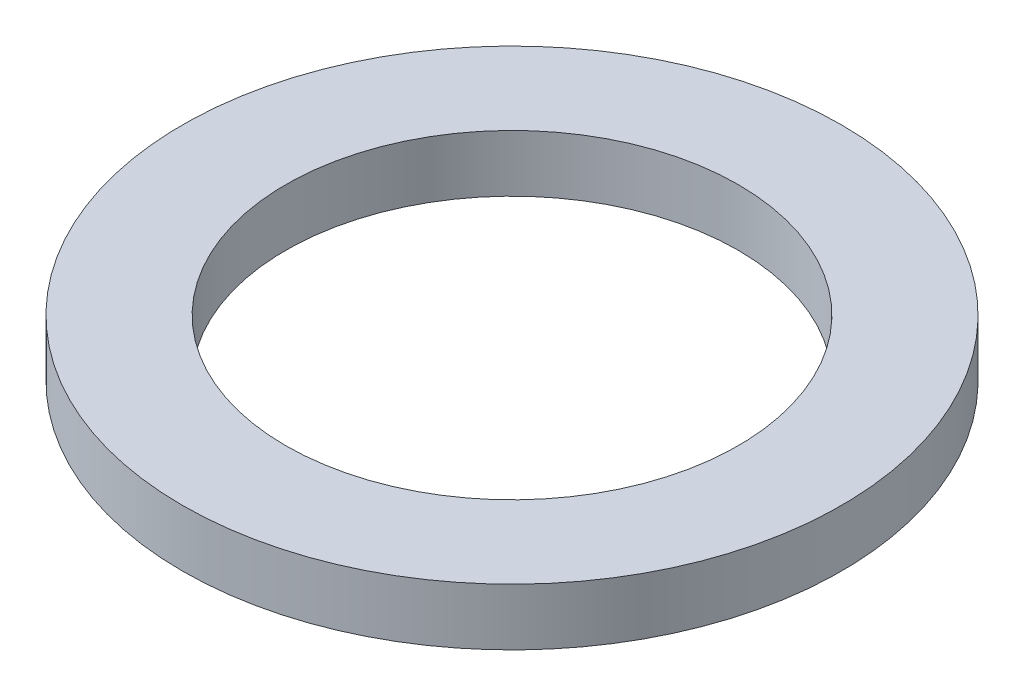
ISO-10303-21;
HEADER;
FILE_DESCRIPTION(('STEP AP214'),'2;1');
FILE_NAME('part.step','',(''),(''),'','','');
FILE_SCHEMA(('AUTOMOTIVE_DESIGN { 1 0 10303 214 1 1 1 1 }'));
ENDSEC;
DATA;
#1=APPLICATION_CONTEXT('core data for automotive mechanical design processes');
#2=APPLICATION_PROTOCOL_DEFINITION('international standard','automotive_design',2000,#1);
#3=PRODUCT_CONTEXT('',#1,'mechanical');
#4=PRODUCT('Part','Part','',(#3));
#5=PRODUCT_RELATED_PRODUCT_CATEGORY('part','',(#4));
#6=PRODUCT_DEFINITION_FORMATION('','',#4);
#7=PRODUCT_DEFINITION_CONTEXT('part definition',#1,'design');
#8=PRODUCT_DEFINITION('design','',#6,#7);
#9=PRODUCT_DEFINITION_SHAPE('','',#8);
#10=(LENGTH_UNIT() NAMED_UNIT(*) SI_UNIT(.MILLI.,.METRE.));
#11=(NAMED_UNIT(*) PLANE_ANGLE_UNIT() SI_UNIT($,.RADIAN.));
#12=(NAMED_UNIT(*) SI_UNIT($,.STERADIAN.) SOLID_ANGLE_UNIT());
#13=UNCERTAINTY_MEASURE_WITH_UNIT(LENGTH_MEASURE(1.E-05),#10,'distance_accuracy_value','');
#14=(GEOMETRIC_REPRESENTATION_CONTEXT(3) GLOBAL_UNCERTAINTY_ASSIGNED_CONTEXT((#13)) GLOBAL_UNIT_ASSIGNED_CONTEXT((#10,
#11,#12)) REPRESENTATION_CONTEXT('',''));
#15=CARTESIAN_POINT('',(0.,0.,0.));
#16=DIRECTION('',(0.,0.,1.));
#17=DIRECTION('',(1.,0.,0.));
#18=AXIS2_PLACEMENT_3D('',#15,#16,#17);
#19=CARTESIAN_POINT('',(0.,0.4826,0.));
#20=DIRECTION('',(0.,1.,0.));
#21=DIRECTION('',(0.,0.,1.));
#22=AXIS2_PLACEMENT_3D('',#19,#20,#21);
#23=PLANE('',#22);
#24=CARTESIAN_POINT('',(0.,0.4826,0.));
#25=DIRECTION('',(0.,1.,0.));
#26=DIRECTION('',(0.,0.,1.));
#27=AXIS2_PLACEMENT_3D('',#24,#25,#26);
#28=CIRCLE('',#27,2.794);
#29=CARTESIAN_POINT('',(0.,0.4826,-2.794));
#30=VERTEX_POINT('',#29);
#31=EDGE_CURVE('E10',#30,#30,#28,.T.);
#32=ORIENTED_EDGE('',*,*,#31,.T.);
#33=EDGE_LOOP('',(#32));
#34=FACE_BOUND('',#33,.T.);
#35=CARTESIAN_POINT('',(0.,0.4826,0.));
#36=DIRECTION('',(0.,1.,0.));
#37=DIRECTION('',(0.,0.,1.));
#38=AXIS2_PLACEMENT_3D('',#35,#36,#37);
#39=CIRCLE('',#38,1.9177);
#40=CARTESIAN_POINT('',(0.,0.4826,-1.9177));
#41=VERTEX_POINT('',#40);
#42=EDGE_CURVE('E41',#41,#41,#39,.T.);
#43=ORIENTED_EDGE('',*,*,#42,.F.);
#44=EDGE_LOOP('',(#43));
#45=FACE_BOUND('',#44,.T.);
#46=ADVANCED_FACE('F30',(#34,#45),#23,.T.);
#47=CARTESIAN_POINT('',(0.,0.,0.));
#48=DIRECTION('',(0.,1.,0.));
#49=DIRECTION('',(0.,0.,1.));
#50=AXIS2_PLACEMENT_3D('',#47,#48,#49);
#51=PLANE('',#50);
#52=CARTESIAN_POINT('',(0.,0.,0.));
#53=DIRECTION('',(0.,1.,0.));
#54=DIRECTION('',(0.,0.,1.));
#55=AXIS2_PLACEMENT_3D('',#52,#53,#54);
#56=CIRCLE('',#55,2.794);
#57=CARTESIAN_POINT('',(0.,0.,-2.794));
#58=VERTEX_POINT('',#57);
#59=EDGE_CURVE('E34',#58,#58,#56,.T.);
#60=ORIENTED_EDGE('',*,*,#59,.F.);
#61=EDGE_LOOP('',(#60));
#62=FACE_BOUND('',#61,.T.);
#63=CARTESIAN_POINT('',(0.,0.,0.));
#64=DIRECTION('',(0.,1.,0.));
#65=DIRECTION('',(0.,0.,1.));
#66=AXIS2_PLACEMENT_3D('',#63,#64,#65);
#67=CIRCLE('',#66,1.9177);
#68=CARTESIAN_POINT('',(0.,0.,-1.9177));
#69=VERTEX_POINT('',#68);
#70=EDGE_CURVE('E43',#69,#69,#67,.T.);
#71=ORIENTED_EDGE('',*,*,#70,.T.);
#72=EDGE_LOOP('',(#71));
#73=FACE_BOUND('',#72,.T.);
#74=ADVANCED_FACE('F53',(#62,#73),#51,.F.);
#75=CARTESIAN_POINT('',(0.,0.4826,0.));
#76=DIRECTION('',(0.,-1.,0.));
#77=DIRECTION('',(0.,0.,-1.));
#78=AXIS2_PLACEMENT_3D('',#75,#76,#77);
#79=CYLINDRICAL_SURFACE('',#78,2.794);
#80=CARTESIAN_POINT('',(0.,0.4826,-2.794));
#81=CARTESIAN_POINT('',(0.,0.477572916666667,-2.794));
#82=CARTESIAN_POINT('',(0.,0.472545833333333,-2.794));
#83=CARTESIAN_POINT('',(0.,0.462491666666667,-2.794));
#84=CARTESIAN_POINT('',(0.,0.457464583333333,-2.794));
#85=CARTESIAN_POINT('',(0.,0.447410416666667,-2.794));
#86=CARTESIAN_POINT('',(0.,0.442383333333333,-2.794));
#87=CARTESIAN_POINT('',(0.,0.432329166666667,-2.794));
#88=CARTESIAN_POINT('',(0.,0.427302083333333,-2.794));
#89=CARTESIAN_POINT('',(0.,0.417247916666667,-2.794));
#90=CARTESIAN_POINT('',(0.,0.412220833333333,-2.794));
#91=CARTESIAN_POINT('',(0.,0.402166666666667,-2.794));
#92=CARTESIAN_POINT('',(0.,0.397139583333333,-2.794));
#93=CARTESIAN_POINT('',(0.,0.387085416666667,-2.794));
#94=CARTESIAN_POINT('',(0.,0.382058333333333,-2.794));
#95=CARTESIAN_POINT('',(0.,0.372004166666667,-2.794));
#96=CARTESIAN_POINT('',(0.,0.366977083333333,-2.794));
#97=CARTESIAN_POINT('',(0.,0.356922916666667,-2.794));
#98=CARTESIAN_POINT('',(0.,0.351895833333333,-2.794));
#99=CARTESIAN_POINT('',(0.,0.341841666666667,-2.794));
#100=CARTESIAN_POINT('',(0.,0.336814583333333,-2.794));
#101=CARTESIAN_POINT('',(0.,0.326760416666667,-2.794));
#102=CARTESIAN_POINT('',(0.,0.321733333333333,-2.794));
#103=CARTESIAN_POINT('',(0.,0.311679166666667,-2.794));
#104=CARTESIAN_POINT('',(0.,0.306652083333333,-2.794));
#105=CARTESIAN_POINT('',(0.,0.296597916666667,-2.794));
#106=CARTESIAN_POINT('',(0.,0.291570833333333,-2.794));
#107=CARTESIAN_POINT('',(0.,0.281516666666667,-2.794));
#108=CARTESIAN_POINT('',(0.,0.276489583333333,-2.794));
#109=CARTESIAN_POINT('',(0.,0.266435416666667,-2.794));
#110=CARTESIAN_POINT('',(0.,0.261408333333333,-2.794));
#111=CARTESIAN_POINT('',(0.,0.251354166666667,-2.794));
#112=CARTESIAN_POINT('',(0.,0.246327083333333,-2.794));
#113=CARTESIAN_POINT('',(0.,0.236272916666667,-2.794));
#114=CARTESIAN_POINT('',(0.,0.231245833333333,-2.794));
#115=CARTESIAN_POINT('',(0.,0.221191666666667,-2.794));
#116=CARTESIAN_POINT('',(0.,0.216164583333333,-2.794));
#117=CARTESIAN_POINT('',(0.,0.206110416666667,-2.794));
#118=CARTESIAN_POINT('',(0.,0.201083333333333,-2.794));
#119=CARTESIAN_POINT('',(0.,0.191029166666667,-2.794));
#120=CARTESIAN_POINT('',(0.,0.186002083333333,-2.794));
#121=CARTESIAN_POINT('',(0.,0.175947916666667,-2.794));
#122=CARTESIAN_POINT('',(0.,0.170920833333333,-2.794));
#123=CARTESIAN_POINT('',(0.,0.160866666666667,-2.794));
#124=CARTESIAN_POINT('',(0.,0.155839583333333,-2.794));
#125=CARTESIAN_POINT('',(0.,0.145785416666667,-2.794));
#126=CARTESIAN_POINT('',(0.,0.140758333333333,-2.794));
#127=CARTESIAN_POINT('',(0.,0.130704166666667,-2.794));
#128=CARTESIAN_POINT('',(0.,0.125677083333333,-2.794));
#129=CARTESIAN_POINT('',(0.,0.115622916666667,-2.794));
#130=CARTESIAN_POINT('',(0.,0.110595833333333,-2.794));
#131=CARTESIAN_POINT('',(0.,0.100541666666667,-2.794));
#132=CARTESIAN_POINT('',(0.,0.0955145833333333,-2.794));
#133=CARTESIAN_POINT('',(0.,0.0854604166666667,-2.794));
#134=CARTESIAN_POINT('',(0.,0.0804333333333333,-2.794));
#135=CARTESIAN_POINT('',(0.,0.0703791666666667,-2.794));
#136=CARTESIAN_POINT('',(0.,0.0653520833333334,-2.794));
#137=CARTESIAN_POINT('',(0.,0.0552979166666667,-2.794));
#138=CARTESIAN_POINT('',(0.,0.0502708333333334,-2.794));
#139=CARTESIAN_POINT('',(0.,0.0402166666666667,-2.794));
#140=CARTESIAN_POINT('',(0.,0.0351895833333333,-2.794));
#141=CARTESIAN_POINT('',(0.,0.0251354166666666,-2.794));
#142=CARTESIAN_POINT('',(0.,0.0201083333333333,-2.794));
#143=CARTESIAN_POINT('',(0.,0.0100541666666667,-2.794));
#144=CARTESIAN_POINT('',(0.,0.00502708333333333,-2.794));
#145=CARTESIAN_POINT('',(0.,0.,-2.794));
#146=B_SPLINE_CURVE_WITH_KNOTS('',3,(#80,#81,#82,#83,#84,#85,#86,#87,#88,#89,#90,#91,#92,#93,
#94,#95,#96,#97,#98,#99,#100,#101,#102,#103,#104,#105,#106,#107,#108,#109,#110,#111,#112,#113,
#114,#115,#116,#117,#118,#119,#120,#121,#122,#123,#124,#125,#126,#127,#128,#129,#130,#131,#132,
#133,#134,#135,#136,#137,#138,#139,#140,#141,#142,#143,#144,#145),.UNSPECIFIED.,.F.,.F.,(4,2,2,
2,2,2,2,2,2,2,2,2,2,2,2,2,2,2,2,2,2,2,2,2,2,2,2,2,2,2,2,2,4),(0.,0.01508125,0.0301625,
0.04524375,0.060325,0.07540625,0.0904875,0.10556875,0.12065,0.13573125,0.1508125,0.16589375,
0.180975,0.19605625,0.2111375,0.22621875,0.2413,0.25638125,0.2714625,0.28654375,0.301625,
0.31670625,0.3317875,0.34686875,0.36195,0.37703125,0.3921125,0.40719375,0.422275,0.43735625,
0.4524375,0.46751875,0.4826),.UNSPECIFIED.);
#147=EDGE_CURVE('BSEAM32',#30,#58,#146,.T.);
#148=ORIENTED_EDGE('',*,*,#31,.F.);
#149=ORIENTED_EDGE('',*,*,#59,.T.);
#150=ORIENTED_EDGE('',*,*,#147,.T.);
#151=ORIENTED_EDGE('',*,*,#147,.F.);
#152=EDGE_LOOP('',(#148,#150,#149,#151));
#153=FACE_BOUND('',#152,.T.);
#154=ADVANCED_FACE('F32',(#153),#79,.T.);
#155=CARTESIAN_POINT('',(0.,0.4826,0.));
#156=DIRECTION('',(0.,-1.,0.));
#157=DIRECTION('',(0.,0.,-1.));
#158=AXIS2_PLACEMENT_3D('',#155,#156,#157);
#159=CYLINDRICAL_SURFACE('',#158,1.9177);
#160=CARTESIAN_POINT('',(0.,0.4826,-1.9177));
#161=CARTESIAN_POINT('',(0.,0.477572916666667,-1.9177));
#162=CARTESIAN_POINT('',(0.,0.472545833333333,-1.9177));
#163=CARTESIAN_POINT('',(0.,0.462491666666667,-1.9177));
#164=CARTESIAN_POINT('',(0.,0.457464583333333,-1.9177));
#165=CARTESIAN_POINT('',(0.,0.447410416666667,-1.9177));
#166=CARTESIAN_POINT('',(0.,0.442383333333333,-1.9177));
#167=CARTESIAN_POINT('',(0.,0.432329166666667,-1.9177));
#168=CARTESIAN_POINT('',(0.,0.427302083333333,-1.9177));
#169=CARTESIAN_POINT('',(0.,0.417247916666667,-1.9177));
#170=CARTESIAN_POINT('',(0.,0.412220833333333,-1.9177));
#171=CARTESIAN_POINT('',(0.,0.402166666666667,-1.9177));
#172=CARTESIAN_POINT('',(0.,0.397139583333333,-1.9177));
#173=CARTESIAN_POINT('',(0.,0.387085416666667,-1.9177));
#174=CARTESIAN_POINT('',(0.,0.382058333333333,-1.9177));
#175=CARTESIAN_POINT('',(0.,0.372004166666667,-1.9177));
#176=CARTESIAN_POINT('',(0.,0.366977083333333,-1.9177));
#177=CARTESIAN_POINT('',(0.,0.356922916666667,-1.9177));
#178=CARTESIAN_POINT('',(0.,0.351895833333333,-1.9177));
#179=CARTESIAN_POINT('',(0.,0.341841666666667,-1.9177));
#180=CARTESIAN_POINT('',(0.,0.336814583333333,-1.9177));
#181=CARTESIAN_POINT('',(0.,0.326760416666667,-1.9177));
#182=CARTESIAN_POINT('',(0.,0.321733333333333,-1.9177));
#183=CARTESIAN_POINT('',(0.,0.311679166666667,-1.9177));
#184=CARTESIAN_POINT('',(0.,0.306652083333333,-1.9177));
#185=CARTESIAN_POINT('',(0.,0.296597916666667,-1.9177));
#186=CARTESIAN_POINT('',(0.,0.291570833333333,-1.9177));
#187=CARTESIAN_POINT('',(0.,0.281516666666667,-1.9177));
#188=CARTESIAN_POINT('',(0.,0.276489583333333,-1.9177));
#189=CARTESIAN_POINT('',(0.,0.266435416666667,-1.9177));
#190=CARTESIAN_POINT('',(0.,0.261408333333333,-1.9177));
#191=CARTESIAN_POINT('',(0.,0.251354166666667,-1.9177));
#192=CARTESIAN_POINT('',(0.,0.246327083333333,-1.9177));
#193=CARTESIAN_POINT('',(0.,0.236272916666667,-1.9177));
#194=CARTESIAN_POINT('',(0.,0.231245833333333,-1.9177));
#195=CARTESIAN_POINT('',(0.,0.221191666666667,-1.9177));
#196=CARTESIAN_POINT('',(0.,0.216164583333333,-1.9177));
#197=CARTESIAN_POINT('',(0.,0.206110416666667,-1.9177));
#198=CARTESIAN_POINT('',(0.,0.201083333333333,-1.9177));
#199=CARTESIAN_POINT('',(0.,0.191029166666667,-1.9177));
#200=CARTESIAN_POINT('',(0.,0.186002083333333,-1.9177));
#201=CARTESIAN_POINT('',(0.,0.175947916666667,-1.9177));
#202=CARTESIAN_POINT('',(0.,0.170920833333333,-1.9177));
#203=CARTESIAN_POINT('',(0.,0.160866666666667,-1.9177));
#204=CARTESIAN_POINT('',(0.,0.155839583333333,-1.9177));
#205=CARTESIAN_POINT('',(0.,0.145785416666667,-1.9177));
#206=CARTESIAN_POINT('',(0.,0.140758333333333,-1.9177));
#207=CARTESIAN_POINT('',(0.,0.130704166666667,-1.9177));
#208=CARTESIAN_POINT('',(0.,0.125677083333333,-1.9177));
#209=CARTESIAN_POINT('',(0.,0.115622916666667,-1.9177));
#210=CARTESIAN_POINT('',(0.,0.110595833333333,-1.9177));
#211=CARTESIAN_POINT('',(0.,0.100541666666667,-1.9177));
#212=CARTESIAN_POINT('',(0.,0.0955145833333333,-1.9177));
#213=CARTESIAN_POINT('',(0.,0.0854604166666667,-1.9177));
#214=CARTESIAN_POINT('',(0.,0.0804333333333333,-1.9177));
#215=CARTESIAN_POINT('',(0.,0.0703791666666667,-1.9177));
#216=CARTESIAN_POINT('',(0.,0.0653520833333334,-1.9177));
#217=CARTESIAN_POINT('',(0.,0.0552979166666667,-1.9177));
#218=CARTESIAN_POINT('',(0.,0.0502708333333333,-1.9177));
#219=CARTESIAN_POINT('',(0.,0.0402166666666666,-1.9177));
#220=CARTESIAN_POINT('',(0.,0.0351895833333333,-1.9177));
#221=CARTESIAN_POINT('',(0.,0.0251354166666666,-1.9177));
#222=CARTESIAN_POINT('',(0.,0.0201083333333333,-1.9177));
#223=CARTESIAN_POINT('',(0.,0.0100541666666667,-1.9177));
#224=CARTESIAN_POINT('',(0.,0.00502708333333333,-1.9177));
#225=CARTESIAN_POINT('',(0.,0.,-1.9177));
#226=B_SPLINE_CURVE_WITH_KNOTS('',3,(#160,#161,#162,#163,#164,#165,#166,#167,#168,#169,#170,
#171,#172,#173,#174,#175,#176,#177,#178,#179,#180,#181,#182,#183,#184,#185,#186,#187,#188,#189,
#190,#191,#192,#193,#194,#195,#196,#197,#198,#199,#200,#201,#202,#203,#204,#205,#206,#207,#208,
#209,#210,#211,#212,#213,#214,#215,#216,#217,#218,#219,#220,#221,#222,#223,#224,#225),
.UNSPECIFIED.,.F.,.F.,(4,2,2,2,2,2,2,2,2,2,2,2,2,2,2,2,2,2,2,2,2,2,2,2,2,2,2,2,2,2,2,2,4),(0.,
0.01508125,0.0301625,0.04524375,0.060325,0.07540625,0.0904874999999999,0.10556875,0.12065,
0.13573125,0.1508125,0.16589375,0.180975,0.19605625,0.2111375,0.22621875,0.2413,0.25638125,
0.2714625,0.28654375,0.301625,0.31670625,0.3317875,0.34686875,0.36195,0.37703125,0.3921125,
0.40719375,0.422275,0.43735625,0.4524375,0.46751875,0.4826),.UNSPECIFIED.);
#227=EDGE_CURVE('BSEAM49',#41,#69,#226,.T.);
#228=ORIENTED_EDGE('',*,*,#42,.T.);
#229=ORIENTED_EDGE('',*,*,#70,.F.);
#230=ORIENTED_EDGE('',*,*,#227,.T.);
#231=ORIENTED_EDGE('',*,*,#227,.F.);
#232=EDGE_LOOP('',(#228,#230,#229,#231));
#233=FACE_BOUND('',#232,.T.);
#234=ADVANCED_FACE('F49',(#233),#159,.F.);
#235=CLOSED_SHELL('',(#46,#74,#154,#234));
#236=MANIFOLD_SOLID_BREP('B2',#235);
#237=ADVANCED_BREP_SHAPE_REPRESENTATION('',(#18,#236),#14);
#238=SHAPE_DEFINITION_REPRESENTATION(#9,#237);
ENDSEC;
END-ISO-10303-21;
